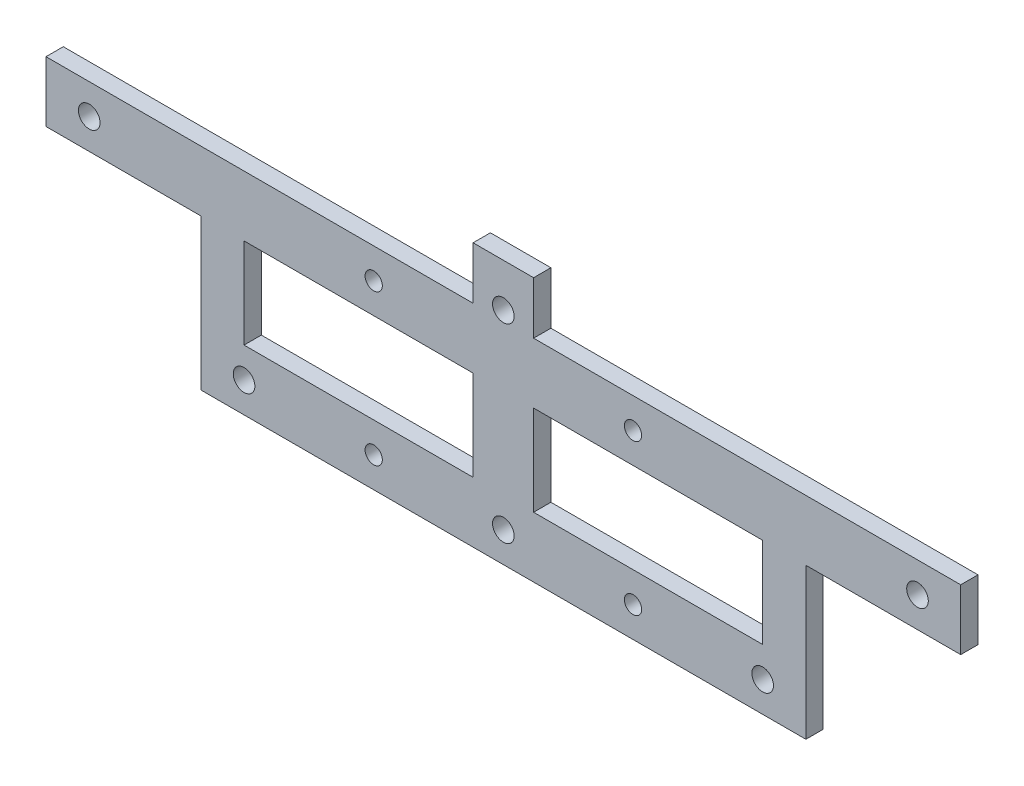
ISO-10303-21;
HEADER;
FILE_DESCRIPTION(('STEP AP214'),'2;1');
FILE_NAME('part.step','',(''),(''),'','','');
FILE_SCHEMA(('AUTOMOTIVE_DESIGN { 1 0 10303 214 1 1 1 1 }'));
ENDSEC;
DATA;
#1=APPLICATION_CONTEXT('core data for automotive mechanical design processes');
#2=APPLICATION_PROTOCOL_DEFINITION('international standard','automotive_design',2000,#1);
#3=PRODUCT_CONTEXT('',#1,'mechanical');
#4=PRODUCT('Part','Part','',(#3));
#5=PRODUCT_RELATED_PRODUCT_CATEGORY('part','',(#4));
#6=PRODUCT_DEFINITION_FORMATION('','',#4);
#7=PRODUCT_DEFINITION_CONTEXT('part definition',#1,'design');
#8=PRODUCT_DEFINITION('design','',#6,#7);
#9=PRODUCT_DEFINITION_SHAPE('','',#8);
#10=(LENGTH_UNIT() NAMED_UNIT(*) SI_UNIT(.MILLI.,.METRE.));
#11=(NAMED_UNIT(*) PLANE_ANGLE_UNIT() SI_UNIT($,.RADIAN.));
#12=(NAMED_UNIT(*) SI_UNIT($,.STERADIAN.) SOLID_ANGLE_UNIT());
#13=UNCERTAINTY_MEASURE_WITH_UNIT(LENGTH_MEASURE(1.E-05),#10,'distance_accuracy_value','');
#14=(GEOMETRIC_REPRESENTATION_CONTEXT(3) GLOBAL_UNCERTAINTY_ASSIGNED_CONTEXT((#13)) GLOBAL_UNIT_ASSIGNED_CONTEXT((#10,
#11,#12)) REPRESENTATION_CONTEXT('',''));
#15=CARTESIAN_POINT('',(0.,0.,0.));
#16=DIRECTION('',(0.,0.,1.));
#17=DIRECTION('',(1.,0.,0.));
#18=AXIS2_PLACEMENT_3D('',#15,#16,#17);
#19=CARTESIAN_POINT('',(60.,0.,4.));
#20=DIRECTION('',(-1.,0.,0.));
#21=DIRECTION('',(0.,0.,1.));
#22=AXIS2_PLACEMENT_3D('',#19,#20,#21);
#23=PLANE('',#22);
#24=DIRECTION('',(0.,1.,0.));
#25=VECTOR('',#24,1.);
#26=CARTESIAN_POINT('',(60.,0.,0.));
#27=LINE('',#26,#25);
#28=CARTESIAN_POINT('',(60.,7.,0.));
#29=VERTEX_POINT('',#28);
#30=CARTESIAN_POINT('',(60.,27.8779466073845,0.));
#31=VERTEX_POINT('',#30);
#32=EDGE_CURVE('E358',#29,#31,#27,.T.);
#33=ORIENTED_EDGE('',*,*,#32,.F.);
#34=DIRECTION('',(0.,0.,-1.));
#35=VECTOR('',#34,1.);
#36=CARTESIAN_POINT('',(60.,7.,4.));
#37=LINE('',#36,#35);
#38=CARTESIAN_POINT('',(60.,7.,4.));
#39=VERTEX_POINT('',#38);
#40=EDGE_CURVE('E11',#39,#29,#37,.T.);
#41=ORIENTED_EDGE('',*,*,#40,.F.);
#42=DIRECTION('',(0.,1.,0.));
#43=VECTOR('',#42,1.);
#44=CARTESIAN_POINT('',(60.,0.,4.));
#45=LINE('',#44,#43);
#46=CARTESIAN_POINT('',(60.,27.8779466073845,4.));
#47=VERTEX_POINT('',#46);
#48=EDGE_CURVE('E203',#39,#47,#45,.T.);
#49=ORIENTED_EDGE('',*,*,#48,.T.);
#50=DIRECTION('',(0.,0.,-1.));
#51=VECTOR('',#50,1.);
#52=CARTESIAN_POINT('',(60.,27.8779466073845,4.));
#53=LINE('',#52,#51);
#54=EDGE_CURVE('E127',#47,#31,#53,.T.);
#55=ORIENTED_EDGE('',*,*,#54,.T.);
#56=EDGE_LOOP('',(#33,#41,#49,#55));
#57=FACE_BOUND('',#56,.T.);
#58=ADVANCED_FACE('F37',(#57),#23,.T.);
#59=CARTESIAN_POINT('',(0.,7.,4.));
#60=DIRECTION('',(0.,1.,0.));
#61=DIRECTION('',(0.,0.,1.));
#62=AXIS2_PLACEMENT_3D('',#59,#60,#61);
#63=PLANE('',#62);
#64=DIRECTION('',(1.,0.,0.));
#65=VECTOR('',#64,1.);
#66=CARTESIAN_POINT('',(0.,7.,0.));
#67=LINE('',#66,#65);
#68=CARTESIAN_POINT('',(7.,7.,0.));
#69=VERTEX_POINT('',#68);
#70=EDGE_CURVE('E191',#69,#29,#67,.T.);
#71=ORIENTED_EDGE('',*,*,#70,.F.);
#72=DIRECTION('',(0.,0.,-1.));
#73=VECTOR('',#72,1.);
#74=CARTESIAN_POINT('',(7.,7.,4.));
#75=LINE('',#74,#73);
#76=CARTESIAN_POINT('',(7.,7.,4.));
#77=VERTEX_POINT('',#76);
#78=EDGE_CURVE('E47',#77,#69,#75,.T.);
#79=ORIENTED_EDGE('',*,*,#78,.F.);
#80=DIRECTION('',(1.,0.,0.));
#81=VECTOR('',#80,1.);
#82=CARTESIAN_POINT('',(0.,7.,4.));
#83=LINE('',#82,#81);
#84=EDGE_CURVE('E189',#77,#39,#83,.T.);
#85=ORIENTED_EDGE('',*,*,#84,.T.);
#86=ORIENTED_EDGE('',*,*,#40,.T.);
#87=EDGE_LOOP('',(#71,#79,#85,#86));
#88=FACE_BOUND('',#87,.T.);
#89=ADVANCED_FACE('F187',(#88),#63,.T.);
#90=CARTESIAN_POINT('',(7.,0.,4.));
#91=DIRECTION('',(-1.,0.,0.));
#92=DIRECTION('',(0.,0.,1.));
#93=AXIS2_PLACEMENT_3D('',#90,#91,#92);
#94=PLANE('',#93);
#95=DIRECTION('',(0.,1.,0.));
#96=VECTOR('',#95,1.);
#97=CARTESIAN_POINT('',(7.,0.,0.));
#98=LINE('',#97,#96);
#99=CARTESIAN_POINT('',(7.,27.8779466073845,0.));
#100=VERTEX_POINT('',#99);
#101=EDGE_CURVE('E324',#69,#100,#98,.T.);
#102=ORIENTED_EDGE('',*,*,#101,.T.);
#103=DIRECTION('',(0.,0.,-1.));
#104=VECTOR('',#103,1.);
#105=CARTESIAN_POINT('',(7.,27.8779466073845,4.));
#106=LINE('',#105,#104);
#107=CARTESIAN_POINT('',(7.,27.8779466073845,4.));
#108=VERTEX_POINT('',#107);
#109=EDGE_CURVE('E194',#108,#100,#106,.T.);
#110=ORIENTED_EDGE('',*,*,#109,.F.);
#111=DIRECTION('',(0.,1.,0.));
#112=VECTOR('',#111,1.);
#113=CARTESIAN_POINT('',(7.,0.,4.));
#114=LINE('',#113,#112);
#115=EDGE_CURVE('E197',#77,#108,#114,.T.);
#116=ORIENTED_EDGE('',*,*,#115,.F.);
#117=ORIENTED_EDGE('',*,*,#78,.T.);
#118=EDGE_LOOP('',(#102,#110,#116,#117));
#119=FACE_BOUND('',#118,.T.);
#120=ADVANCED_FACE('F198',(#119),#94,.F.);
#121=CARTESIAN_POINT('',(-60.,7.,0.));
#122=VERTEX_POINT('',#121);
#123=CARTESIAN_POINT('',(-7.,7.,0.));
#124=VERTEX_POINT('',#123);
#125=EDGE_CURVE('E346',#122,#124,#67,.T.);
#126=ORIENTED_EDGE('',*,*,#125,.F.);
#127=DIRECTION('',(0.,0.,-1.));
#128=VECTOR('',#127,1.);
#129=CARTESIAN_POINT('',(-60.,7.,4.));
#130=LINE('',#129,#128);
#131=CARTESIAN_POINT('',(-60.,7.,4.));
#132=VERTEX_POINT('',#131);
#133=EDGE_CURVE('E263',#132,#122,#130,.T.);
#134=ORIENTED_EDGE('',*,*,#133,.F.);
#135=CARTESIAN_POINT('',(-7.,7.,4.));
#136=VERTEX_POINT('',#135);
#137=EDGE_CURVE('E205',#132,#136,#83,.T.);
#138=ORIENTED_EDGE('',*,*,#137,.T.);
#139=DIRECTION('',(0.,0.,-1.));
#140=VECTOR('',#139,1.);
#141=CARTESIAN_POINT('',(-7.,7.,4.));
#142=LINE('',#141,#140);
#143=EDGE_CURVE('E265',#136,#124,#142,.T.);
#144=ORIENTED_EDGE('',*,*,#143,.T.);
#145=EDGE_LOOP('',(#126,#134,#138,#144));
#146=FACE_BOUND('',#145,.T.);
#147=ADVANCED_FACE('F402',(#146),#63,.T.);
#148=CARTESIAN_POINT('',(-60.,0.,4.));
#149=DIRECTION('',(-1.,0.,0.));
#150=DIRECTION('',(0.,0.,1.));
#151=AXIS2_PLACEMENT_3D('',#148,#149,#150);
#152=PLANE('',#151);
#153=DIRECTION('',(0.,1.,0.));
#154=VECTOR('',#153,1.);
#155=CARTESIAN_POINT('',(-60.,0.,0.));
#156=LINE('',#155,#154);
#157=CARTESIAN_POINT('',(-60.,27.8779466073845,0.));
#158=VERTEX_POINT('',#157);
#159=EDGE_CURVE('E349',#122,#158,#156,.T.);
#160=ORIENTED_EDGE('',*,*,#159,.T.);
#161=DIRECTION('',(0.,0.,-1.));
#162=VECTOR('',#161,1.);
#163=CARTESIAN_POINT('',(-60.,27.8779466073845,4.));
#164=LINE('',#163,#162);
#165=CARTESIAN_POINT('',(-60.,27.8779466073845,4.));
#166=VERTEX_POINT('',#165);
#167=EDGE_CURVE('E269',#166,#158,#164,.T.);
#168=ORIENTED_EDGE('',*,*,#167,.F.);
#169=DIRECTION('',(0.,1.,0.));
#170=VECTOR('',#169,1.);
#171=CARTESIAN_POINT('',(-60.,0.,4.));
#172=LINE('',#171,#170);
#173=EDGE_CURVE('E211',#132,#166,#172,.T.);
#174=ORIENTED_EDGE('',*,*,#173,.F.);
#175=ORIENTED_EDGE('',*,*,#133,.T.);
#176=EDGE_LOOP('',(#160,#168,#174,#175));
#177=FACE_BOUND('',#176,.T.);
#178=ADVANCED_FACE('F423',(#177),#152,.F.);
#179=CARTESIAN_POINT('',(0.,27.8779466073845,4.));
#180=DIRECTION('',(0.,1.,0.));
#181=DIRECTION('',(0.,0.,1.));
#182=AXIS2_PLACEMENT_3D('',#179,#180,#181);
#183=PLANE('',#182);
#184=DIRECTION('',(1.,0.,0.));
#185=VECTOR('',#184,1.);
#186=CARTESIAN_POINT('',(0.,27.8779466073845,0.));
#187=LINE('',#186,#185);
#188=CARTESIAN_POINT('',(-7.,27.8779466073845,0.));
#189=VERTEX_POINT('',#188);
#190=EDGE_CURVE('E341',#158,#189,#187,.T.);
#191=ORIENTED_EDGE('',*,*,#190,.T.);
#192=DIRECTION('',(0.,0.,-1.));
#193=VECTOR('',#192,1.);
#194=CARTESIAN_POINT('',(-7.,27.8779466073845,4.));
#195=LINE('',#194,#193);
#196=CARTESIAN_POINT('',(-7.,27.8779466073845,4.));
#197=VERTEX_POINT('',#196);
#198=EDGE_CURVE('E267',#197,#189,#195,.T.);
#199=ORIENTED_EDGE('',*,*,#198,.F.);
#200=DIRECTION('',(1.,0.,0.));
#201=VECTOR('',#200,1.);
#202=CARTESIAN_POINT('',(0.,27.8779466073845,4.));
#203=LINE('',#202,#201);
#204=EDGE_CURVE('E217',#166,#197,#203,.T.);
#205=ORIENTED_EDGE('',*,*,#204,.F.);
#206=ORIENTED_EDGE('',*,*,#167,.T.);
#207=EDGE_LOOP('',(#191,#199,#205,#206));
#208=FACE_BOUND('',#207,.T.);
#209=ADVANCED_FACE('F420',(#208),#183,.F.);
#210=CARTESIAN_POINT('',(70.,0.,4.));
#211=DIRECTION('',(1.,0.,0.));
#212=DIRECTION('',(0.,0.,-1.));
#213=AXIS2_PLACEMENT_3D('',#210,#211,#212);
#214=PLANE('',#213);
#215=DIRECTION('',(0.,-1.,0.));
#216=VECTOR('',#215,1.);
#217=CARTESIAN_POINT('',(70.,0.,0.));
#218=LINE('',#217,#216);
#219=CARTESIAN_POINT('',(70.,27.8779466073845,0.));
#220=VERTEX_POINT('',#219);
#221=CARTESIAN_POINT('',(70.,-7.,0.));
#222=VERTEX_POINT('',#221);
#223=EDGE_CURVE('E308',#220,#222,#218,.T.);
#224=ORIENTED_EDGE('',*,*,#223,.F.);
#225=DIRECTION('',(0.,0.,-1.));
#226=VECTOR('',#225,1.);
#227=CARTESIAN_POINT('',(70.,27.8779466073845,4.));
#228=LINE('',#227,#226);
#229=CARTESIAN_POINT('',(70.,27.8779466073845,4.));
#230=VERTEX_POINT('',#229);
#231=EDGE_CURVE('E41',#230,#220,#228,.T.);
#232=ORIENTED_EDGE('',*,*,#231,.F.);
#233=DIRECTION('',(0.,-1.,0.));
#234=VECTOR('',#233,1.);
#235=CARTESIAN_POINT('',(70.,0.,4.));
#236=LINE('',#235,#234);
#237=CARTESIAN_POINT('',(70.,-7.,4.));
#238=VERTEX_POINT('',#237);
#239=EDGE_CURVE('E250',#230,#238,#236,.T.);
#240=ORIENTED_EDGE('',*,*,#239,.T.);
#241=DIRECTION('',(0.,0.,-1.));
#242=VECTOR('',#241,1.);
#243=CARTESIAN_POINT('',(70.,-7.,4.));
#244=LINE('',#243,#242);
#245=EDGE_CURVE('E273',#238,#222,#244,.T.);
#246=ORIENTED_EDGE('',*,*,#245,.T.);
#247=EDGE_LOOP('',(#224,#232,#240,#246));
#248=FACE_BOUND('',#247,.T.);
#249=ADVANCED_FACE('F39',(#248),#214,.T.);
#250=CARTESIAN_POINT('',(0.,27.8779466073845,4.));
#251=DIRECTION('',(0.,1.,0.));
#252=DIRECTION('',(0.,0.,1.));
#253=AXIS2_PLACEMENT_3D('',#250,#251,#252);
#254=PLANE('',#253);
#255=DIRECTION('',(1.,0.,0.));
#256=VECTOR('',#255,1.);
#257=CARTESIAN_POINT('',(0.,27.8779466073845,0.));
#258=LINE('',#257,#256);
#259=CARTESIAN_POINT('',(105.826370740733,27.8779466073845,0.));
#260=VERTEX_POINT('',#259);
#261=EDGE_CURVE('E301',#220,#260,#258,.T.);
#262=ORIENTED_EDGE('',*,*,#261,.T.);
#263=DIRECTION('',(0.,0.,-1.));
#264=VECTOR('',#263,1.);
#265=CARTESIAN_POINT('',(105.826370740733,27.8779466073845,4.));
#266=LINE('',#265,#264);
#267=CARTESIAN_POINT('',(105.826370740733,27.8779466073845,4.));
#268=VERTEX_POINT('',#267);
#269=EDGE_CURVE('E293',#268,#260,#266,.T.);
#270=ORIENTED_EDGE('',*,*,#269,.F.);
#271=DIRECTION('',(1.,0.,0.));
#272=VECTOR('',#271,1.);
#273=CARTESIAN_POINT('',(0.,27.8779466073845,4.));
#274=LINE('',#273,#272);
#275=EDGE_CURVE('E248',#230,#268,#274,.T.);
#276=ORIENTED_EDGE('',*,*,#275,.F.);
#277=ORIENTED_EDGE('',*,*,#231,.T.);
#278=EDGE_LOOP('',(#262,#270,#276,#277));
#279=FACE_BOUND('',#278,.T.);
#280=ADVANCED_FACE('F300',(#279),#254,.F.);
#281=CARTESIAN_POINT('',(105.826370740733,0.,4.));
#282=DIRECTION('',(1.,0.,0.));
#283=DIRECTION('',(0.,0.,-1.));
#284=AXIS2_PLACEMENT_3D('',#281,#282,#283);
#285=PLANE('',#284);
#286=DIRECTION('',(0.,-1.,0.));
#287=VECTOR('',#286,1.);
#288=CARTESIAN_POINT('',(105.826370740733,0.,0.));
#289=LINE('',#288,#287);
#290=CARTESIAN_POINT('',(105.826370740733,41.8779466073845,0.));
#291=VERTEX_POINT('',#290);
#292=EDGE_CURVE('E310',#291,#260,#289,.T.);
#293=ORIENTED_EDGE('',*,*,#292,.F.);
#294=DIRECTION('',(0.,0.,-1.));
#295=VECTOR('',#294,1.);
#296=CARTESIAN_POINT('',(105.826370740733,41.8779466073845,4.));
#297=LINE('',#296,#295);
#298=CARTESIAN_POINT('',(105.826370740733,41.8779466073845,4.));
#299=VERTEX_POINT('',#298);
#300=EDGE_CURVE('E292',#299,#291,#297,.T.);
#301=ORIENTED_EDGE('',*,*,#300,.F.);
#302=DIRECTION('',(0.,-1.,0.));
#303=VECTOR('',#302,1.);
#304=CARTESIAN_POINT('',(105.826370740733,0.,4.));
#305=LINE('',#304,#303);
#306=EDGE_CURVE('E245',#299,#268,#305,.T.);
#307=ORIENTED_EDGE('',*,*,#306,.T.);
#308=ORIENTED_EDGE('',*,*,#269,.T.);
#309=EDGE_LOOP('',(#293,#301,#307,#308));
#310=FACE_BOUND('',#309,.T.);
#311=ADVANCED_FACE('F451',(#310),#285,.T.);
#312=CARTESIAN_POINT('',(0.,41.8779466073845,4.));
#313=DIRECTION('',(0.,1.,0.));
#314=DIRECTION('',(0.,0.,1.));
#315=AXIS2_PLACEMENT_3D('',#312,#313,#314);
#316=PLANE('',#315);
#317=DIRECTION('',(1.,0.,0.));
#318=VECTOR('',#317,1.);
#319=CARTESIAN_POINT('',(0.,41.8779466073845,0.));
#320=LINE('',#319,#318);
#321=CARTESIAN_POINT('',(7.,41.8779466073845,0.));
#322=VERTEX_POINT('',#321);
#323=EDGE_CURVE('E318',#322,#291,#320,.T.);
#324=ORIENTED_EDGE('',*,*,#323,.F.);
#325=DIRECTION('',(0.,0.,-1.));
#326=VECTOR('',#325,1.);
#327=CARTESIAN_POINT('',(7.,41.8779466073845,4.));
#328=LINE('',#327,#326);
#329=CARTESIAN_POINT('',(7.,41.8779466073845,4.));
#330=VERTEX_POINT('',#329);
#331=EDGE_CURVE('E290',#330,#322,#328,.T.);
#332=ORIENTED_EDGE('',*,*,#331,.F.);
#333=DIRECTION('',(1.,0.,0.));
#334=VECTOR('',#333,1.);
#335=CARTESIAN_POINT('',(0.,41.8779466073845,4.));
#336=LINE('',#335,#334);
#337=EDGE_CURVE('E242',#330,#299,#336,.T.);
#338=ORIENTED_EDGE('',*,*,#337,.T.);
#339=ORIENTED_EDGE('',*,*,#300,.T.);
#340=EDGE_LOOP('',(#324,#332,#338,#339));
#341=FACE_BOUND('',#340,.T.);
#342=ADVANCED_FACE('F449',(#341),#316,.T.);
#343=CARTESIAN_POINT('',(7.,54.,0.));
#344=VERTEX_POINT('',#343);
#345=EDGE_CURVE('E320',#322,#344,#98,.T.);
#346=ORIENTED_EDGE('',*,*,#345,.T.);
#347=DIRECTION('',(0.,0.,-1.));
#348=VECTOR('',#347,1.);
#349=CARTESIAN_POINT('',(7.,54.,4.));
#350=LINE('',#349,#348);
#351=CARTESIAN_POINT('',(7.,54.,4.));
#352=VERTEX_POINT('',#351);
#353=EDGE_CURVE('E288',#352,#344,#350,.T.);
#354=ORIENTED_EDGE('',*,*,#353,.F.);
#355=EDGE_CURVE('E200',#330,#352,#114,.T.);
#356=ORIENTED_EDGE('',*,*,#355,.F.);
#357=ORIENTED_EDGE('',*,*,#331,.T.);
#358=EDGE_LOOP('',(#346,#354,#356,#357));
#359=FACE_BOUND('',#358,.T.);
#360=ADVANCED_FACE('F447',(#359),#94,.F.);
#361=CARTESIAN_POINT('',(0.,54.,4.));
#362=DIRECTION('',(0.,1.,0.));
#363=DIRECTION('',(0.,0.,1.));
#364=AXIS2_PLACEMENT_3D('',#361,#362,#363);
#365=PLANE('',#364);
#366=DIRECTION('',(1.,0.,0.));
#367=VECTOR('',#366,1.);
#368=CARTESIAN_POINT('',(0.,54.,0.));
#369=LINE('',#368,#367);
#370=CARTESIAN_POINT('',(-7.,54.,0.));
#371=VERTEX_POINT('',#370);
#372=EDGE_CURVE('E323',#371,#344,#369,.T.);
#373=ORIENTED_EDGE('',*,*,#372,.F.);
#374=DIRECTION('',(0.,0.,-1.));
#375=VECTOR('',#374,1.);
#376=CARTESIAN_POINT('',(-7.,54.,4.));
#377=LINE('',#376,#375);
#378=CARTESIAN_POINT('',(-7.,54.,4.));
#379=VERTEX_POINT('',#378);
#380=EDGE_CURVE('E286',#379,#371,#377,.T.);
#381=ORIENTED_EDGE('',*,*,#380,.F.);
#382=DIRECTION('',(1.,0.,0.));
#383=VECTOR('',#382,1.);
#384=CARTESIAN_POINT('',(0.,54.,4.));
#385=LINE('',#384,#383);
#386=EDGE_CURVE('E238',#379,#352,#385,.T.);
#387=ORIENTED_EDGE('',*,*,#386,.T.);
#388=ORIENTED_EDGE('',*,*,#353,.T.);
#389=EDGE_LOOP('',(#373,#381,#387,#388));
#390=FACE_BOUND('',#389,.T.);
#391=ADVANCED_FACE('F444',(#390),#365,.T.);
#392=CARTESIAN_POINT('',(-7.,0.,4.));
#393=DIRECTION('',(-1.,0.,0.));
#394=DIRECTION('',(0.,0.,1.));
#395=AXIS2_PLACEMENT_3D('',#392,#393,#394);
#396=PLANE('',#395);
#397=DIRECTION('',(0.,1.,0.));
#398=VECTOR('',#397,1.);
#399=CARTESIAN_POINT('',(-7.,0.,0.));
#400=LINE('',#399,#398);
#401=CARTESIAN_POINT('',(-7.,41.8779466073845,0.));
#402=VERTEX_POINT('',#401);
#403=EDGE_CURVE('E327',#402,#371,#400,.T.);
#404=ORIENTED_EDGE('',*,*,#403,.F.);
#405=DIRECTION('',(0.,0.,-1.));
#406=VECTOR('',#405,1.);
#407=CARTESIAN_POINT('',(-7.,41.8779466073845,4.));
#408=LINE('',#407,#406);
#409=CARTESIAN_POINT('',(-7.,41.8779466073845,4.));
#410=VERTEX_POINT('',#409);
#411=EDGE_CURVE('E284',#410,#402,#408,.T.);
#412=ORIENTED_EDGE('',*,*,#411,.F.);
#413=DIRECTION('',(0.,1.,0.));
#414=VECTOR('',#413,1.);
#415=CARTESIAN_POINT('',(-7.,0.,4.));
#416=LINE('',#415,#414);
#417=EDGE_CURVE('E235',#410,#379,#416,.T.);
#418=ORIENTED_EDGE('',*,*,#417,.T.);
#419=ORIENTED_EDGE('',*,*,#380,.T.);
#420=EDGE_LOOP('',(#404,#412,#418,#419));
#421=FACE_BOUND('',#420,.T.);
#422=ADVANCED_FACE('F419',(#421),#396,.T.);
#423=CARTESIAN_POINT('',(0.,41.8779466073845,4.));
#424=DIRECTION('',(0.,1.,0.));
#425=DIRECTION('',(0.,0.,1.));
#426=AXIS2_PLACEMENT_3D('',#423,#424,#425);
#427=PLANE('',#426);
#428=DIRECTION('',(1.,0.,0.));
#429=VECTOR('',#428,1.);
#430=CARTESIAN_POINT('',(0.,41.8779466073845,0.));
#431=LINE('',#430,#429);
#432=CARTESIAN_POINT('',(-105.826370740733,41.8779466073845,0.));
#433=VERTEX_POINT('',#432);
#434=EDGE_CURVE('E330',#433,#402,#431,.T.);
#435=ORIENTED_EDGE('',*,*,#434,.F.);
#436=DIRECTION('',(0.,0.,-1.));
#437=VECTOR('',#436,1.);
#438=CARTESIAN_POINT('',(-105.826370740733,41.8779466073845,4.));
#439=LINE('',#438,#437);
#440=CARTESIAN_POINT('',(-105.826370740733,41.8779466073845,4.));
#441=VERTEX_POINT('',#440);
#442=EDGE_CURVE('E282',#441,#433,#439,.T.);
#443=ORIENTED_EDGE('',*,*,#442,.F.);
#444=DIRECTION('',(1.,0.,0.));
#445=VECTOR('',#444,1.);
#446=CARTESIAN_POINT('',(0.,41.8779466073845,4.));
#447=LINE('',#446,#445);
#448=EDGE_CURVE('E232',#441,#410,#447,.T.);
#449=ORIENTED_EDGE('',*,*,#448,.T.);
#450=ORIENTED_EDGE('',*,*,#411,.T.);
#451=EDGE_LOOP('',(#435,#443,#449,#450));
#452=FACE_BOUND('',#451,.T.);
#453=ADVANCED_FACE('F439',(#452),#427,.T.);
#454=CARTESIAN_POINT('',(-105.826370740733,0.,4.));
#455=DIRECTION('',(-1.,0.,0.));
#456=DIRECTION('',(0.,0.,1.));
#457=AXIS2_PLACEMENT_3D('',#454,#455,#456);
#458=PLANE('',#457);
#459=DIRECTION('',(0.,1.,0.));
#460=VECTOR('',#459,1.);
#461=CARTESIAN_POINT('',(-105.826370740733,0.,0.));
#462=LINE('',#461,#460);
#463=CARTESIAN_POINT('',(-105.826370740733,27.8779466073845,0.));
#464=VERTEX_POINT('',#463);
#465=EDGE_CURVE('E334',#464,#433,#462,.T.);
#466=ORIENTED_EDGE('',*,*,#465,.F.);
#467=DIRECTION('',(0.,0.,-1.));
#468=VECTOR('',#467,1.);
#469=CARTESIAN_POINT('',(-105.826370740733,27.8779466073845,4.));
#470=LINE('',#469,#468);
#471=CARTESIAN_POINT('',(-105.826370740733,27.8779466073845,4.));
#472=VERTEX_POINT('',#471);
#473=EDGE_CURVE('E280',#472,#464,#470,.T.);
#474=ORIENTED_EDGE('',*,*,#473,.F.);
#475=DIRECTION('',(0.,1.,0.));
#476=VECTOR('',#475,1.);
#477=CARTESIAN_POINT('',(-105.826370740733,0.,4.));
#478=LINE('',#477,#476);
#479=EDGE_CURVE('E229',#472,#441,#478,.T.);
#480=ORIENTED_EDGE('',*,*,#479,.T.);
#481=ORIENTED_EDGE('',*,*,#442,.T.);
#482=EDGE_LOOP('',(#466,#474,#480,#481));
#483=FACE_BOUND('',#482,.T.);
#484=ADVANCED_FACE('F436',(#483),#458,.T.);
#485=CARTESIAN_POINT('',(-70.,27.8779466073845,0.));
#486=VERTEX_POINT('',#485);
#487=EDGE_CURVE('E337',#464,#486,#187,.T.);
#488=ORIENTED_EDGE('',*,*,#487,.T.);
#489=DIRECTION('',(0.,0.,-1.));
#490=VECTOR('',#489,1.);
#491=CARTESIAN_POINT('',(-70.,27.8779466073845,4.));
#492=LINE('',#491,#490);
#493=CARTESIAN_POINT('',(-70.,27.8779466073845,4.));
#494=VERTEX_POINT('',#493);
#495=EDGE_CURVE('E278',#494,#486,#492,.T.);
#496=ORIENTED_EDGE('',*,*,#495,.F.);
#497=EDGE_CURVE('E225',#472,#494,#203,.T.);
#498=ORIENTED_EDGE('',*,*,#497,.F.);
#499=ORIENTED_EDGE('',*,*,#473,.T.);
#500=EDGE_LOOP('',(#488,#496,#498,#499));
#501=FACE_BOUND('',#500,.T.);
#502=ADVANCED_FACE('F425',(#501),#183,.F.);
#503=CARTESIAN_POINT('',(-70.,0.,4.));
#504=DIRECTION('',(-1.,0.,0.));
#505=DIRECTION('',(0.,0.,1.));
#506=AXIS2_PLACEMENT_3D('',#503,#504,#505);
#507=PLANE('',#506);
#508=DIRECTION('',(0.,1.,0.));
#509=VECTOR('',#508,1.);
#510=CARTESIAN_POINT('',(-70.,0.,0.));
#511=LINE('',#510,#509);
#512=CARTESIAN_POINT('',(-70.,-7.,0.));
#513=VERTEX_POINT('',#512);
#514=EDGE_CURVE('E340',#513,#486,#511,.T.);
#515=ORIENTED_EDGE('',*,*,#514,.F.);
#516=DIRECTION('',(0.,0.,-1.));
#517=VECTOR('',#516,1.);
#518=CARTESIAN_POINT('',(-70.,-7.,4.));
#519=LINE('',#518,#517);
#520=CARTESIAN_POINT('',(-70.,-7.,4.));
#521=VERTEX_POINT('',#520);
#522=EDGE_CURVE('E275',#521,#513,#519,.T.);
#523=ORIENTED_EDGE('',*,*,#522,.F.);
#524=DIRECTION('',(0.,1.,0.));
#525=VECTOR('',#524,1.);
#526=CARTESIAN_POINT('',(-70.,0.,4.));
#527=LINE('',#526,#525);
#528=EDGE_CURVE('E218',#521,#494,#527,.T.);
#529=ORIENTED_EDGE('',*,*,#528,.T.);
#530=ORIENTED_EDGE('',*,*,#495,.T.);
#531=EDGE_LOOP('',(#515,#523,#529,#530));
#532=FACE_BOUND('',#531,.T.);
#533=ADVANCED_FACE('F392',(#532),#507,.T.);
#534=CARTESIAN_POINT('',(0.,0.,4.));
#535=DIRECTION('',(0.,0.,-1.));
#536=DIRECTION('',(-1.,0.,0.));
#537=AXIS2_PLACEMENT_3D('',#534,#535,#536);
#538=CYLINDRICAL_SURFACE('',#537,2.5);
#539=CARTESIAN_POINT('',(0.,0.,4.));
#540=DIRECTION('',(0.,0.,1.));
#541=DIRECTION('',(1.,0.,0.));
#542=AXIS2_PLACEMENT_3D('',#539,#540,#541);
#543=CIRCLE('',#542,2.5);
#544=CARTESIAN_POINT('',(2.5,0.,4.));
#545=VERTEX_POINT('',#544);
#546=EDGE_CURVE('E639',#545,#545,#543,.T.);
#547=ORIENTED_EDGE('',*,*,#546,.T.);
#548=EDGE_LOOP('',(#547));
#549=FACE_BOUND('',#548,.T.);
#550=CARTESIAN_POINT('',(0.,0.,0.));
#551=DIRECTION('',(0.,0.,1.));
#552=DIRECTION('',(1.,0.,0.));
#553=AXIS2_PLACEMENT_3D('',#550,#551,#552);
#554=CIRCLE('',#553,2.5);
#555=CARTESIAN_POINT('',(2.5,0.,0.));
#556=VERTEX_POINT('',#555);
#557=EDGE_CURVE('E253',#556,#556,#554,.T.);
#558=ORIENTED_EDGE('',*,*,#557,.F.);
#559=EDGE_LOOP('',(#558));
#560=FACE_BOUND('',#559,.T.);
#561=ADVANCED_FACE('F382',(#549,#560),#538,.F.);
#562=CARTESIAN_POINT('',(-60.,0.,4.));
#563=DIRECTION('',(0.,0.,-1.));
#564=DIRECTION('',(-1.,0.,0.));
#565=AXIS2_PLACEMENT_3D('',#562,#563,#564);
#566=CYLINDRICAL_SURFACE('',#565,2.5);
#567=CARTESIAN_POINT('',(-60.,0.,4.));
#568=DIRECTION('',(0.,0.,1.));
#569=DIRECTION('',(1.,0.,0.));
#570=AXIS2_PLACEMENT_3D('',#567,#568,#569);
#571=CIRCLE('',#570,2.5);
#572=CARTESIAN_POINT('',(-57.5,0.,4.));
#573=VERTEX_POINT('',#572);
#574=EDGE_CURVE('E641',#573,#573,#571,.T.);
#575=ORIENTED_EDGE('',*,*,#574,.T.);
#576=EDGE_LOOP('',(#575));
#577=FACE_BOUND('',#576,.T.);
#578=CARTESIAN_POINT('',(-60.,0.,0.));
#579=DIRECTION('',(0.,0.,1.));
#580=DIRECTION('',(1.,0.,0.));
#581=AXIS2_PLACEMENT_3D('',#578,#579,#580);
#582=CIRCLE('',#581,2.5);
#583=CARTESIAN_POINT('',(-57.5,0.,0.));
#584=VERTEX_POINT('',#583);
#585=EDGE_CURVE('E258',#584,#584,#582,.T.);
#586=ORIENTED_EDGE('',*,*,#585,.F.);
#587=EDGE_LOOP('',(#586));
#588=FACE_BOUND('',#587,.T.);
#589=ADVANCED_FACE('F379',(#577,#588),#566,.F.);
#590=CARTESIAN_POINT('',(-30.,0.,4.));
#591=DIRECTION('',(0.,0.,-1.));
#592=DIRECTION('',(-1.,0.,0.));
#593=AXIS2_PLACEMENT_3D('',#590,#591,#592);
#594=CYLINDRICAL_SURFACE('',#593,2.);
#595=CARTESIAN_POINT('',(-30.,0.,4.));
#596=DIRECTION('',(0.,0.,1.));
#597=DIRECTION('',(1.,0.,0.));
#598=AXIS2_PLACEMENT_3D('',#595,#596,#597);
#599=CIRCLE('',#598,2.);
#600=CARTESIAN_POINT('',(-28.,0.,4.));
#601=VERTEX_POINT('',#600);
#602=EDGE_CURVE('E643',#601,#601,#599,.T.);
#603=ORIENTED_EDGE('',*,*,#602,.T.);
#604=EDGE_LOOP('',(#603));
#605=FACE_BOUND('',#604,.T.);
#606=CARTESIAN_POINT('',(-30.,0.,0.));
#607=DIRECTION('',(0.,0.,1.));
#608=DIRECTION('',(1.,0.,0.));
#609=AXIS2_PLACEMENT_3D('',#606,#607,#608);
#610=CIRCLE('',#609,2.);
#611=CARTESIAN_POINT('',(-28.,0.,0.));
#612=VERTEX_POINT('',#611);
#613=EDGE_CURVE('E372',#612,#612,#610,.T.);
#614=ORIENTED_EDGE('',*,*,#613,.F.);
#615=EDGE_LOOP('',(#614));
#616=FACE_BOUND('',#615,.T.);
#617=ADVANCED_FACE('F381',(#605,#616),#594,.F.);
#618=CARTESIAN_POINT('',(30.,0.,4.));
#619=DIRECTION('',(0.,0.,-1.));
#620=DIRECTION('',(-1.,0.,0.));
#621=AXIS2_PLACEMENT_3D('',#618,#619,#620);
#622=CYLINDRICAL_SURFACE('',#621,2.);
#623=CARTESIAN_POINT('',(30.,0.,4.));
#624=DIRECTION('',(0.,0.,1.));
#625=DIRECTION('',(1.,0.,0.));
#626=AXIS2_PLACEMENT_3D('',#623,#624,#625);
#627=CIRCLE('',#626,2.);
#628=CARTESIAN_POINT('',(32.,0.,4.));
#629=VERTEX_POINT('',#628);
#630=EDGE_CURVE('E648',#629,#629,#627,.T.);
#631=ORIENTED_EDGE('',*,*,#630,.T.);
#632=EDGE_LOOP('',(#631));
#633=FACE_BOUND('',#632,.T.);
#634=CARTESIAN_POINT('',(30.,0.,0.));
#635=DIRECTION('',(0.,0.,1.));
#636=DIRECTION('',(1.,0.,0.));
#637=AXIS2_PLACEMENT_3D('',#634,#635,#636);
#638=CIRCLE('',#637,2.);
#639=CARTESIAN_POINT('',(32.,0.,0.));
#640=VERTEX_POINT('',#639);
#641=EDGE_CURVE('E369',#640,#640,#638,.T.);
#642=ORIENTED_EDGE('',*,*,#641,.F.);
#643=EDGE_LOOP('',(#642));
#644=FACE_BOUND('',#643,.T.);
#645=ADVANCED_FACE('F389',(#633,#644),#622,.F.);
#646=CARTESIAN_POINT('',(95.8263707407328,34.8779466073846,4.));
#647=DIRECTION('',(0.,0.,-1.));
#648=DIRECTION('',(-1.,0.,0.));
#649=AXIS2_PLACEMENT_3D('',#646,#647,#648);
#650=CYLINDRICAL_SURFACE('',#649,2.5);
#651=CARTESIAN_POINT('',(95.8263707407328,34.8779466073846,4.));
#652=DIRECTION('',(0.,0.,1.));
#653=DIRECTION('',(1.,0.,0.));
#654=AXIS2_PLACEMENT_3D('',#651,#652,#653);
#655=CIRCLE('',#654,2.5);
#656=CARTESIAN_POINT('',(98.3263707407328,34.8779466073846,4.));
#657=VERTEX_POINT('',#656);
#658=EDGE_CURVE('E651',#657,#657,#655,.T.);
#659=ORIENTED_EDGE('',*,*,#658,.T.);
#660=EDGE_LOOP('',(#659));
#661=FACE_BOUND('',#660,.T.);
#662=CARTESIAN_POINT('',(95.8263707407328,34.8779466073846,0.));
#663=DIRECTION('',(0.,0.,1.));
#664=DIRECTION('',(1.,0.,0.));
#665=AXIS2_PLACEMENT_3D('',#662,#663,#664);
#666=CIRCLE('',#665,2.5);
#667=CARTESIAN_POINT('',(98.3263707407328,34.8779466073846,0.));
#668=VERTEX_POINT('',#667);
#669=EDGE_CURVE('E366',#668,#668,#666,.T.);
#670=ORIENTED_EDGE('',*,*,#669,.F.);
#671=EDGE_LOOP('',(#670));
#672=FACE_BOUND('',#671,.T.);
#673=ADVANCED_FACE('F512',(#661,#672),#650,.F.);
#674=CARTESIAN_POINT('',(30.,34.8779466073845,4.));
#675=DIRECTION('',(0.,0.,-1.));
#676=DIRECTION('',(-1.,0.,0.));
#677=AXIS2_PLACEMENT_3D('',#674,#675,#676);
#678=CYLINDRICAL_SURFACE('',#677,2.);
#679=CARTESIAN_POINT('',(30.,34.8779466073845,4.));
#680=DIRECTION('',(0.,0.,1.));
#681=DIRECTION('',(1.,0.,0.));
#682=AXIS2_PLACEMENT_3D('',#679,#680,#681);
#683=CIRCLE('',#682,2.);
#684=CARTESIAN_POINT('',(32.,34.8779466073845,4.));
#685=VERTEX_POINT('',#684);
#686=EDGE_CURVE('E654',#685,#685,#683,.T.);
#687=ORIENTED_EDGE('',*,*,#686,.T.);
#688=EDGE_LOOP('',(#687));
#689=FACE_BOUND('',#688,.T.);
#690=CARTESIAN_POINT('',(30.,34.8779466073845,0.));
#691=DIRECTION('',(0.,0.,1.));
#692=DIRECTION('',(1.,0.,0.));
#693=AXIS2_PLACEMENT_3D('',#690,#691,#692);
#694=CIRCLE('',#693,2.);
#695=CARTESIAN_POINT('',(32.,34.8779466073845,0.));
#696=VERTEX_POINT('',#695);
#697=EDGE_CURVE('E363',#696,#696,#694,.T.);
#698=ORIENTED_EDGE('',*,*,#697,.F.);
#699=EDGE_LOOP('',(#698));
#700=FACE_BOUND('',#699,.T.);
#701=ADVANCED_FACE('F522',(#689,#700),#678,.F.);
#702=CARTESIAN_POINT('',(0.,44.,4.));
#703=DIRECTION('',(0.,0.,-1.));
#704=DIRECTION('',(-1.,0.,0.));
#705=AXIS2_PLACEMENT_3D('',#702,#703,#704);
#706=CYLINDRICAL_SURFACE('',#705,2.5);
#707=CARTESIAN_POINT('',(0.,44.,4.));
#708=DIRECTION('',(0.,0.,1.));
#709=DIRECTION('',(1.,0.,0.));
#710=AXIS2_PLACEMENT_3D('',#707,#708,#709);
#711=CIRCLE('',#710,2.5);
#712=CARTESIAN_POINT('',(2.5,44.,4.));
#713=VERTEX_POINT('',#712);
#714=EDGE_CURVE('E657',#713,#713,#711,.T.);
#715=ORIENTED_EDGE('',*,*,#714,.T.);
#716=EDGE_LOOP('',(#715));
#717=FACE_BOUND('',#716,.T.);
#718=CARTESIAN_POINT('',(0.,44.,0.));
#719=DIRECTION('',(0.,0.,1.));
#720=DIRECTION('',(1.,0.,0.));
#721=AXIS2_PLACEMENT_3D('',#718,#719,#720);
#722=CIRCLE('',#721,2.5);
#723=CARTESIAN_POINT('',(2.5,44.,0.));
#724=VERTEX_POINT('',#723);
#725=EDGE_CURVE('E360',#724,#724,#722,.T.);
#726=ORIENTED_EDGE('',*,*,#725,.F.);
#727=EDGE_LOOP('',(#726));
#728=FACE_BOUND('',#727,.T.);
#729=ADVANCED_FACE('F532',(#717,#728),#706,.F.);
#730=EDGE_CURVE('E120',#100,#31,#258,.T.);
#731=ORIENTED_EDGE('',*,*,#730,.T.);
#732=ORIENTED_EDGE('',*,*,#54,.F.);
#733=EDGE_CURVE('E56',#108,#47,#274,.T.);
#734=ORIENTED_EDGE('',*,*,#733,.F.);
#735=ORIENTED_EDGE('',*,*,#109,.T.);
#736=EDGE_LOOP('',(#731,#732,#734,#735));
#737=FACE_BOUND('',#736,.T.);
#738=ADVANCED_FACE('F409',(#737),#254,.F.);
#739=CARTESIAN_POINT('',(-95.8263707407328,34.8779466073845,4.));
#740=DIRECTION('',(0.,0.,-1.));
#741=DIRECTION('',(-1.,0.,0.));
#742=AXIS2_PLACEMENT_3D('',#739,#740,#741);
#743=CYLINDRICAL_SURFACE('',#742,2.50000000000001);
#744=CARTESIAN_POINT('',(-95.8263707407328,34.8779466073845,4.));
#745=DIRECTION('',(0.,0.,1.));
#746=DIRECTION('',(1.,0.,0.));
#747=AXIS2_PLACEMENT_3D('',#744,#745,#746);
#748=CIRCLE('',#747,2.50000000000001);
#749=CARTESIAN_POINT('',(-93.3263707407328,34.8779466073845,4.));
#750=VERTEX_POINT('',#749);
#751=EDGE_CURVE('E206',#750,#750,#748,.T.);
#752=ORIENTED_EDGE('',*,*,#751,.T.);
#753=EDGE_LOOP('',(#752));
#754=FACE_BOUND('',#753,.T.);
#755=CARTESIAN_POINT('',(-95.8263707407328,34.8779466073845,0.));
#756=DIRECTION('',(0.,0.,1.));
#757=DIRECTION('',(1.,0.,0.));
#758=AXIS2_PLACEMENT_3D('',#755,#756,#757);
#759=CIRCLE('',#758,2.50000000000001);
#760=CARTESIAN_POINT('',(-93.3263707407328,34.8779466073845,0.));
#761=VERTEX_POINT('',#760);
#762=EDGE_CURVE('E355',#761,#761,#759,.T.);
#763=ORIENTED_EDGE('',*,*,#762,.F.);
#764=EDGE_LOOP('',(#763));
#765=FACE_BOUND('',#764,.T.);
#766=ADVANCED_FACE('F405',(#754,#765),#743,.F.);
#767=CARTESIAN_POINT('',(-30.,34.8779466073845,4.));
#768=DIRECTION('',(0.,0.,-1.));
#769=DIRECTION('',(-1.,0.,0.));
#770=AXIS2_PLACEMENT_3D('',#767,#768,#769);
#771=CYLINDRICAL_SURFACE('',#770,2.);
#772=CARTESIAN_POINT('',(-30.,34.8779466073845,4.));
#773=DIRECTION('',(0.,0.,1.));
#774=DIRECTION('',(1.,0.,0.));
#775=AXIS2_PLACEMENT_3D('',#772,#773,#774);
#776=CIRCLE('',#775,2.);
#777=CARTESIAN_POINT('',(-28.,34.8779466073845,4.));
#778=VERTEX_POINT('',#777);
#779=EDGE_CURVE('E662',#778,#778,#776,.T.);
#780=ORIENTED_EDGE('',*,*,#779,.T.);
#781=EDGE_LOOP('',(#780));
#782=FACE_BOUND('',#781,.T.);
#783=CARTESIAN_POINT('',(-30.,34.8779466073845,0.));
#784=DIRECTION('',(0.,0.,1.));
#785=DIRECTION('',(1.,0.,0.));
#786=AXIS2_PLACEMENT_3D('',#783,#784,#785);
#787=CIRCLE('',#786,2.);
#788=CARTESIAN_POINT('',(-28.,34.8779466073845,0.));
#789=VERTEX_POINT('',#788);
#790=EDGE_CURVE('E352',#789,#789,#787,.T.);
#791=ORIENTED_EDGE('',*,*,#790,.F.);
#792=EDGE_LOOP('',(#791));
#793=FACE_BOUND('',#792,.T.);
#794=ADVANCED_FACE('F408',(#782,#793),#771,.F.);
#795=EDGE_CURVE('E331',#124,#189,#400,.T.);
#796=ORIENTED_EDGE('',*,*,#795,.F.);
#797=ORIENTED_EDGE('',*,*,#143,.F.);
#798=EDGE_CURVE('E239',#136,#197,#416,.T.);
#799=ORIENTED_EDGE('',*,*,#798,.T.);
#800=ORIENTED_EDGE('',*,*,#198,.T.);
#801=EDGE_LOOP('',(#796,#797,#799,#800));
#802=FACE_BOUND('',#801,.T.);
#803=ADVANCED_FACE('F413',(#802),#396,.T.);
#804=CARTESIAN_POINT('',(0.,-7.,4.));
#805=DIRECTION('',(0.,1.,0.));
#806=DIRECTION('',(0.,0.,1.));
#807=AXIS2_PLACEMENT_3D('',#804,#805,#806);
#808=PLANE('',#807);
#809=DIRECTION('',(1.,0.,0.));
#810=VECTOR('',#809,1.);
#811=CARTESIAN_POINT('',(0.,-7.,0.));
#812=LINE('',#811,#810);
#813=EDGE_CURVE('E344',#513,#222,#812,.T.);
#814=ORIENTED_EDGE('',*,*,#813,.T.);
#815=ORIENTED_EDGE('',*,*,#245,.F.);
#816=DIRECTION('',(1.,0.,0.));
#817=VECTOR('',#816,1.);
#818=CARTESIAN_POINT('',(0.,-7.,4.));
#819=LINE('',#818,#817);
#820=EDGE_CURVE('E212',#521,#238,#819,.T.);
#821=ORIENTED_EDGE('',*,*,#820,.F.);
#822=ORIENTED_EDGE('',*,*,#522,.T.);
#823=EDGE_LOOP('',(#814,#815,#821,#822));
#824=FACE_BOUND('',#823,.T.);
#825=ADVANCED_FACE('F417',(#824),#808,.F.);
#826=CARTESIAN_POINT('',(60.,0.,4.));
#827=DIRECTION('',(0.,0.,-1.));
#828=DIRECTION('',(-1.,0.,0.));
#829=AXIS2_PLACEMENT_3D('',#826,#827,#828);
#830=CYLINDRICAL_SURFACE('',#829,2.5);
#831=CARTESIAN_POINT('',(60.,0.,4.));
#832=DIRECTION('',(0.,0.,1.));
#833=DIRECTION('',(1.,0.,0.));
#834=AXIS2_PLACEMENT_3D('',#831,#832,#833);
#835=CIRCLE('',#834,2.5);
#836=CARTESIAN_POINT('',(62.5,0.,4.));
#837=VERTEX_POINT('',#836);
#838=EDGE_CURVE('E276',#837,#837,#835,.T.);
#839=ORIENTED_EDGE('',*,*,#838,.T.);
#840=EDGE_LOOP('',(#839));
#841=FACE_BOUND('',#840,.T.);
#842=CARTESIAN_POINT('',(60.,0.,0.));
#843=DIRECTION('',(0.,0.,1.));
#844=DIRECTION('',(1.,0.,0.));
#845=AXIS2_PLACEMENT_3D('',#842,#843,#844);
#846=CIRCLE('',#845,2.5);
#847=CARTESIAN_POINT('',(62.5,0.,0.));
#848=VERTEX_POINT('',#847);
#849=EDGE_CURVE('E251',#848,#848,#846,.T.);
#850=ORIENTED_EDGE('',*,*,#849,.F.);
#851=EDGE_LOOP('',(#850));
#852=FACE_BOUND('',#851,.T.);
#853=ADVANCED_FACE('F431',(#841,#852),#830,.F.);
#854=CARTESIAN_POINT('',(0.,0.,4.));
#855=DIRECTION('',(0.,0.,1.));
#856=DIRECTION('',(1.,0.,0.));
#857=AXIS2_PLACEMENT_3D('',#854,#855,#856);
#858=PLANE('',#857);
#859=ORIENTED_EDGE('',*,*,#239,.F.);
#860=ORIENTED_EDGE('',*,*,#275,.T.);
#861=ORIENTED_EDGE('',*,*,#306,.F.);
#862=ORIENTED_EDGE('',*,*,#337,.F.);
#863=ORIENTED_EDGE('',*,*,#355,.T.);
#864=ORIENTED_EDGE('',*,*,#386,.F.);
#865=ORIENTED_EDGE('',*,*,#417,.F.);
#866=ORIENTED_EDGE('',*,*,#448,.F.);
#867=ORIENTED_EDGE('',*,*,#479,.F.);
#868=ORIENTED_EDGE('',*,*,#497,.T.);
#869=ORIENTED_EDGE('',*,*,#528,.F.);
#870=ORIENTED_EDGE('',*,*,#820,.T.);
#871=EDGE_LOOP('',(#859,#860,#861,#862,#863,#864,#865,#866,#867,#868,#869,#870));
#872=FACE_BOUND('',#871,.T.);
#873=ORIENTED_EDGE('',*,*,#137,.F.);
#874=ORIENTED_EDGE('',*,*,#173,.T.);
#875=ORIENTED_EDGE('',*,*,#204,.T.);
#876=ORIENTED_EDGE('',*,*,#798,.F.);
#877=EDGE_LOOP('',(#873,#874,#875,#876));
#878=FACE_BOUND('',#877,.T.);
#879=ORIENTED_EDGE('',*,*,#779,.F.);
#880=EDGE_LOOP('',(#879));
#881=FACE_BOUND('',#880,.T.);
#882=ORIENTED_EDGE('',*,*,#751,.F.);
#883=EDGE_LOOP('',(#882));
#884=FACE_BOUND('',#883,.T.);
#885=ORIENTED_EDGE('',*,*,#48,.F.);
#886=ORIENTED_EDGE('',*,*,#84,.F.);
#887=ORIENTED_EDGE('',*,*,#115,.T.);
#888=ORIENTED_EDGE('',*,*,#733,.T.);
#889=EDGE_LOOP('',(#885,#886,#887,#888));
#890=FACE_BOUND('',#889,.T.);
#891=ORIENTED_EDGE('',*,*,#714,.F.);
#892=EDGE_LOOP('',(#891));
#893=FACE_BOUND('',#892,.T.);
#894=ORIENTED_EDGE('',*,*,#686,.F.);
#895=EDGE_LOOP('',(#894));
#896=FACE_BOUND('',#895,.T.);
#897=ORIENTED_EDGE('',*,*,#658,.F.);
#898=EDGE_LOOP('',(#897));
#899=FACE_BOUND('',#898,.T.);
#900=ORIENTED_EDGE('',*,*,#630,.F.);
#901=EDGE_LOOP('',(#900));
#902=FACE_BOUND('',#901,.T.);
#903=ORIENTED_EDGE('',*,*,#602,.F.);
#904=EDGE_LOOP('',(#903));
#905=FACE_BOUND('',#904,.T.);
#906=ORIENTED_EDGE('',*,*,#574,.F.);
#907=EDGE_LOOP('',(#906));
#908=FACE_BOUND('',#907,.T.);
#909=ORIENTED_EDGE('',*,*,#546,.F.);
#910=EDGE_LOOP('',(#909));
#911=FACE_BOUND('',#910,.T.);
#912=ORIENTED_EDGE('',*,*,#838,.F.);
#913=EDGE_LOOP('',(#912));
#914=FACE_BOUND('',#913,.T.);
#915=ADVANCED_FACE('F201',(#872,#878,#881,#884,#890,#893,#896,#899,#902,#905,#908,#911,#914),
#858,.T.);
#916=CARTESIAN_POINT('',(0.,0.,0.));
#917=DIRECTION('',(0.,0.,1.));
#918=DIRECTION('',(1.,0.,0.));
#919=AXIS2_PLACEMENT_3D('',#916,#917,#918);
#920=PLANE('',#919);
#921=ORIENTED_EDGE('',*,*,#223,.T.);
#922=ORIENTED_EDGE('',*,*,#813,.F.);
#923=ORIENTED_EDGE('',*,*,#514,.T.);
#924=ORIENTED_EDGE('',*,*,#487,.F.);
#925=ORIENTED_EDGE('',*,*,#465,.T.);
#926=ORIENTED_EDGE('',*,*,#434,.T.);
#927=ORIENTED_EDGE('',*,*,#403,.T.);
#928=ORIENTED_EDGE('',*,*,#372,.T.);
#929=ORIENTED_EDGE('',*,*,#345,.F.);
#930=ORIENTED_EDGE('',*,*,#323,.T.);
#931=ORIENTED_EDGE('',*,*,#292,.T.);
#932=ORIENTED_EDGE('',*,*,#261,.F.);
#933=EDGE_LOOP('',(#921,#922,#923,#924,#925,#926,#927,#928,#929,#930,#931,#932));
#934=FACE_BOUND('',#933,.T.);
#935=ORIENTED_EDGE('',*,*,#125,.T.);
#936=ORIENTED_EDGE('',*,*,#795,.T.);
#937=ORIENTED_EDGE('',*,*,#190,.F.);
#938=ORIENTED_EDGE('',*,*,#159,.F.);
#939=EDGE_LOOP('',(#935,#936,#937,#938));
#940=FACE_BOUND('',#939,.T.);
#941=ORIENTED_EDGE('',*,*,#790,.T.);
#942=EDGE_LOOP('',(#941));
#943=FACE_BOUND('',#942,.T.);
#944=ORIENTED_EDGE('',*,*,#762,.T.);
#945=EDGE_LOOP('',(#944));
#946=FACE_BOUND('',#945,.T.);
#947=ORIENTED_EDGE('',*,*,#32,.T.);
#948=ORIENTED_EDGE('',*,*,#730,.F.);
#949=ORIENTED_EDGE('',*,*,#101,.F.);
#950=ORIENTED_EDGE('',*,*,#70,.T.);
#951=EDGE_LOOP('',(#947,#948,#949,#950));
#952=FACE_BOUND('',#951,.T.);
#953=ORIENTED_EDGE('',*,*,#725,.T.);
#954=EDGE_LOOP('',(#953));
#955=FACE_BOUND('',#954,.T.);
#956=ORIENTED_EDGE('',*,*,#697,.T.);
#957=EDGE_LOOP('',(#956));
#958=FACE_BOUND('',#957,.T.);
#959=ORIENTED_EDGE('',*,*,#669,.T.);
#960=EDGE_LOOP('',(#959));
#961=FACE_BOUND('',#960,.T.);
#962=ORIENTED_EDGE('',*,*,#641,.T.);
#963=EDGE_LOOP('',(#962));
#964=FACE_BOUND('',#963,.T.);
#965=ORIENTED_EDGE('',*,*,#613,.T.);
#966=EDGE_LOOP('',(#965));
#967=FACE_BOUND('',#966,.T.);
#968=ORIENTED_EDGE('',*,*,#585,.T.);
#969=EDGE_LOOP('',(#968));
#970=FACE_BOUND('',#969,.T.);
#971=ORIENTED_EDGE('',*,*,#557,.T.);
#972=EDGE_LOOP('',(#971));
#973=FACE_BOUND('',#972,.T.);
#974=ORIENTED_EDGE('',*,*,#849,.T.);
#975=EDGE_LOOP('',(#974));
#976=FACE_BOUND('',#975,.T.);
#977=ADVANCED_FACE('F305',(#934,#940,#943,#946,#952,#955,#958,#961,#964,#967,#970,#973,#976),
#920,.F.);
#978=CLOSED_SHELL('',(#58,#89,#120,#147,#178,#209,#249,#280,#311,#342,#360,#391,#422,#453,#484,
#502,#533,#561,#589,#617,#645,#673,#701,#729,#738,#766,#794,#803,#825,#853,#915,#977));
#979=MANIFOLD_SOLID_BREP('B2',#978);
#980=ADVANCED_BREP_SHAPE_REPRESENTATION('',(#18,#979),#14);
#981=SHAPE_DEFINITION_REPRESENTATION(#9,#980);
ENDSEC;
END-ISO-10303-21;
